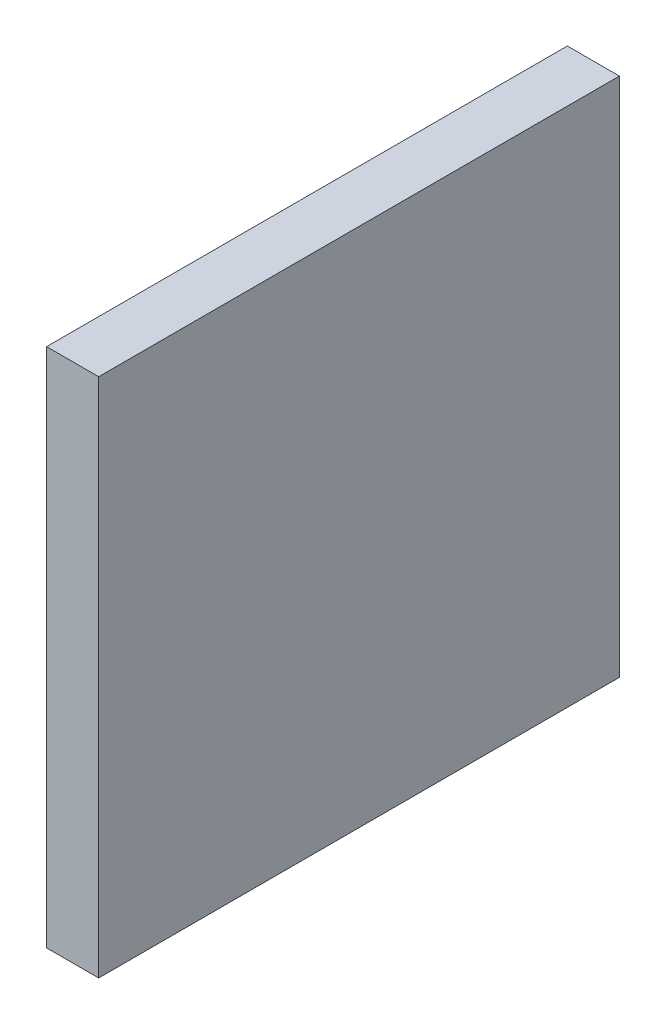
ISO-10303-21;
HEADER;
FILE_DESCRIPTION(('STEP AP214'),'2;1');
FILE_NAME('part.step','',(''),(''),'','','');
FILE_SCHEMA(('AUTOMOTIVE_DESIGN { 1 0 10303 214 1 1 1 1 }'));
ENDSEC;
DATA;
#1=APPLICATION_CONTEXT('core data for automotive mechanical design processes');
#2=APPLICATION_PROTOCOL_DEFINITION('international standard','automotive_design',2000,#1);
#3=PRODUCT_CONTEXT('',#1,'mechanical');
#4=PRODUCT('Part','Part','',(#3));
#5=PRODUCT_RELATED_PRODUCT_CATEGORY('part','',(#4));
#6=PRODUCT_DEFINITION_FORMATION('','',#4);
#7=PRODUCT_DEFINITION_CONTEXT('part definition',#1,'design');
#8=PRODUCT_DEFINITION('design','',#6,#7);
#9=PRODUCT_DEFINITION_SHAPE('','',#8);
#10=(LENGTH_UNIT() NAMED_UNIT(*) SI_UNIT(.MILLI.,.METRE.));
#11=(NAMED_UNIT(*) PLANE_ANGLE_UNIT() SI_UNIT($,.RADIAN.));
#12=(NAMED_UNIT(*) SI_UNIT($,.STERADIAN.) SOLID_ANGLE_UNIT());
#13=UNCERTAINTY_MEASURE_WITH_UNIT(LENGTH_MEASURE(1.E-05),#10,'distance_accuracy_value','');
#14=(GEOMETRIC_REPRESENTATION_CONTEXT(3) GLOBAL_UNCERTAINTY_ASSIGNED_CONTEXT((#13)) GLOBAL_UNIT_ASSIGNED_CONTEXT((#10,
#11,#12)) REPRESENTATION_CONTEXT('',''));
#15=CARTESIAN_POINT('',(0.,0.,0.));
#16=DIRECTION('',(0.,0.,1.));
#17=DIRECTION('',(1.,0.,0.));
#18=AXIS2_PLACEMENT_3D('',#15,#16,#17);
#19=CARTESIAN_POINT('',(-50.,1000.,500.));
#20=DIRECTION('',(1.,0.,0.));
#21=DIRECTION('',(0.,0.,-1.));
#22=AXIS2_PLACEMENT_3D('',#19,#20,#21);
#23=PLANE('',#22);
#24=DIRECTION('',(0.,0.,1.));
#25=VECTOR('',#24,1.);
#26=CARTESIAN_POINT('',(-50.,0.,500.));
#27=LINE('',#26,#25);
#28=CARTESIAN_POINT('',(-50.,0.,-500.));
#29=VERTEX_POINT('',#28);
#30=CARTESIAN_POINT('',(-50.,0.,500.));
#31=VERTEX_POINT('',#30);
#32=EDGE_CURVE('E107',#29,#31,#27,.T.);
#33=ORIENTED_EDGE('',*,*,#32,.T.);
#34=DIRECTION('',(0.,-1.,0.));
#35=VECTOR('',#34,1.);
#36=CARTESIAN_POINT('',(-50.,1000.,500.));
#37=LINE('',#36,#35);
#38=CARTESIAN_POINT('',(-50.,1000.,500.));
#39=VERTEX_POINT('',#38);
#40=EDGE_CURVE('E11',#39,#31,#37,.T.);
#41=ORIENTED_EDGE('',*,*,#40,.F.);
#42=DIRECTION('',(0.,0.,1.));
#43=VECTOR('',#42,1.);
#44=CARTESIAN_POINT('',(-50.,1000.,500.));
#45=LINE('',#44,#43);
#46=CARTESIAN_POINT('',(-50.,1000.,-500.));
#47=VERTEX_POINT('',#46);
#48=EDGE_CURVE('E91',#47,#39,#45,.T.);
#49=ORIENTED_EDGE('',*,*,#48,.F.);
#50=DIRECTION('',(0.,-1.,0.));
#51=VECTOR('',#50,1.);
#52=CARTESIAN_POINT('',(-50.,1000.,-500.));
#53=LINE('',#52,#51);
#54=EDGE_CURVE('E103',#47,#29,#53,.T.);
#55=ORIENTED_EDGE('',*,*,#54,.T.);
#56=EDGE_LOOP('',(#33,#41,#49,#55));
#57=FACE_BOUND('',#56,.T.);
#58=ADVANCED_FACE('F39',(#57),#23,.F.);
#59=CARTESIAN_POINT('',(50.,1000.,500.));
#60=DIRECTION('',(0.,0.,-1.));
#61=DIRECTION('',(-1.,0.,0.));
#62=AXIS2_PLACEMENT_3D('',#59,#60,#61);
#63=PLANE('',#62);
#64=DIRECTION('',(1.,0.,0.));
#65=VECTOR('',#64,1.);
#66=CARTESIAN_POINT('',(50.,0.,500.));
#67=LINE('',#66,#65);
#68=CARTESIAN_POINT('',(50.,0.,500.));
#69=VERTEX_POINT('',#68);
#70=EDGE_CURVE('E96',#31,#69,#67,.T.);
#71=ORIENTED_EDGE('',*,*,#70,.T.);
#72=DIRECTION('',(0.,-1.,0.));
#73=VECTOR('',#72,1.);
#74=CARTESIAN_POINT('',(50.,1000.,500.));
#75=LINE('',#74,#73);
#76=CARTESIAN_POINT('',(50.,1000.,500.));
#77=VERTEX_POINT('',#76);
#78=EDGE_CURVE('E48',#77,#69,#75,.T.);
#79=ORIENTED_EDGE('',*,*,#78,.F.);
#80=DIRECTION('',(1.,0.,0.));
#81=VECTOR('',#80,1.);
#82=CARTESIAN_POINT('',(50.,1000.,500.));
#83=LINE('',#82,#81);
#84=EDGE_CURVE('E86',#39,#77,#83,.T.);
#85=ORIENTED_EDGE('',*,*,#84,.F.);
#86=ORIENTED_EDGE('',*,*,#40,.T.);
#87=EDGE_LOOP('',(#71,#79,#85,#86));
#88=FACE_BOUND('',#87,.T.);
#89=ADVANCED_FACE('F95',(#88),#63,.F.);
#90=CARTESIAN_POINT('',(50.,1000.,500.));
#91=DIRECTION('',(-1.,0.,0.));
#92=DIRECTION('',(0.,0.,1.));
#93=AXIS2_PLACEMENT_3D('',#90,#91,#92);
#94=PLANE('',#93);
#95=DIRECTION('',(0.,0.,-1.));
#96=VECTOR('',#95,1.);
#97=CARTESIAN_POINT('',(50.,0.,500.));
#98=LINE('',#97,#96);
#99=CARTESIAN_POINT('',(50.,0.,-500.));
#100=VERTEX_POINT('',#99);
#101=EDGE_CURVE('E73',#69,#100,#98,.T.);
#102=ORIENTED_EDGE('',*,*,#101,.T.);
#103=DIRECTION('',(0.,-1.,0.));
#104=VECTOR('',#103,1.);
#105=CARTESIAN_POINT('',(50.,1000.,-500.));
#106=LINE('',#105,#104);
#107=CARTESIAN_POINT('',(50.,1000.,-500.));
#108=VERTEX_POINT('',#107);
#109=EDGE_CURVE('E98',#108,#100,#106,.T.);
#110=ORIENTED_EDGE('',*,*,#109,.F.);
#111=DIRECTION('',(0.,0.,-1.));
#112=VECTOR('',#111,1.);
#113=CARTESIAN_POINT('',(50.,1000.,500.));
#114=LINE('',#113,#112);
#115=EDGE_CURVE('E89',#77,#108,#114,.T.);
#116=ORIENTED_EDGE('',*,*,#115,.F.);
#117=ORIENTED_EDGE('',*,*,#78,.T.);
#118=EDGE_LOOP('',(#102,#110,#116,#117));
#119=FACE_BOUND('',#118,.T.);
#120=ADVANCED_FACE('F99',(#119),#94,.F.);
#121=CARTESIAN_POINT('',(50.,1000.,-500.));
#122=DIRECTION('',(0.,0.,1.));
#123=DIRECTION('',(1.,0.,0.));
#124=AXIS2_PLACEMENT_3D('',#121,#122,#123);
#125=PLANE('',#124);
#126=DIRECTION('',(-1.,0.,0.));
#127=VECTOR('',#126,1.);
#128=CARTESIAN_POINT('',(50.,0.,-500.));
#129=LINE('',#128,#127);
#130=EDGE_CURVE('E79',#100,#29,#129,.T.);
#131=ORIENTED_EDGE('',*,*,#130,.T.);
#132=ORIENTED_EDGE('',*,*,#54,.F.);
#133=DIRECTION('',(-1.,0.,0.));
#134=VECTOR('',#133,1.);
#135=CARTESIAN_POINT('',(50.,1000.,-500.));
#136=LINE('',#135,#134);
#137=EDGE_CURVE('E56',#108,#47,#136,.T.);
#138=ORIENTED_EDGE('',*,*,#137,.F.);
#139=ORIENTED_EDGE('',*,*,#109,.T.);
#140=EDGE_LOOP('',(#131,#132,#138,#139));
#141=FACE_BOUND('',#140,.T.);
#142=ADVANCED_FACE('F120',(#141),#125,.F.);
#143=CARTESIAN_POINT('',(0.,1000.,0.));
#144=DIRECTION('',(0.,1.,0.));
#145=DIRECTION('',(0.,0.,1.));
#146=AXIS2_PLACEMENT_3D('',#143,#144,#145);
#147=PLANE('',#146);
#148=ORIENTED_EDGE('',*,*,#48,.T.);
#149=ORIENTED_EDGE('',*,*,#84,.T.);
#150=ORIENTED_EDGE('',*,*,#115,.T.);
#151=ORIENTED_EDGE('',*,*,#137,.T.);
#152=EDGE_LOOP('',(#148,#149,#150,#151));
#153=FACE_BOUND('',#152,.T.);
#154=ADVANCED_FACE('F87',(#153),#147,.T.);
#155=CARTESIAN_POINT('',(0.,0.,0.));
#156=DIRECTION('',(0.,1.,0.));
#157=DIRECTION('',(0.,0.,1.));
#158=AXIS2_PLACEMENT_3D('',#155,#156,#157);
#159=PLANE('',#158);
#160=ORIENTED_EDGE('',*,*,#32,.F.);
#161=ORIENTED_EDGE('',*,*,#130,.F.);
#162=ORIENTED_EDGE('',*,*,#101,.F.);
#163=ORIENTED_EDGE('',*,*,#70,.F.);
#164=EDGE_LOOP('',(#160,#161,#162,#163));
#165=FACE_BOUND('',#164,.T.);
#166=ADVANCED_FACE('F123',(#165),#159,.F.);
#167=CLOSED_SHELL('',(#58,#89,#120,#142,#154,#166));
#168=MANIFOLD_SOLID_BREP('B2',#167);
#169=ADVANCED_BREP_SHAPE_REPRESENTATION('',(#18,#168),#14);
#170=SHAPE_DEFINITION_REPRESENTATION(#9,#169);
ENDSEC;
END-ISO-10303-21;
